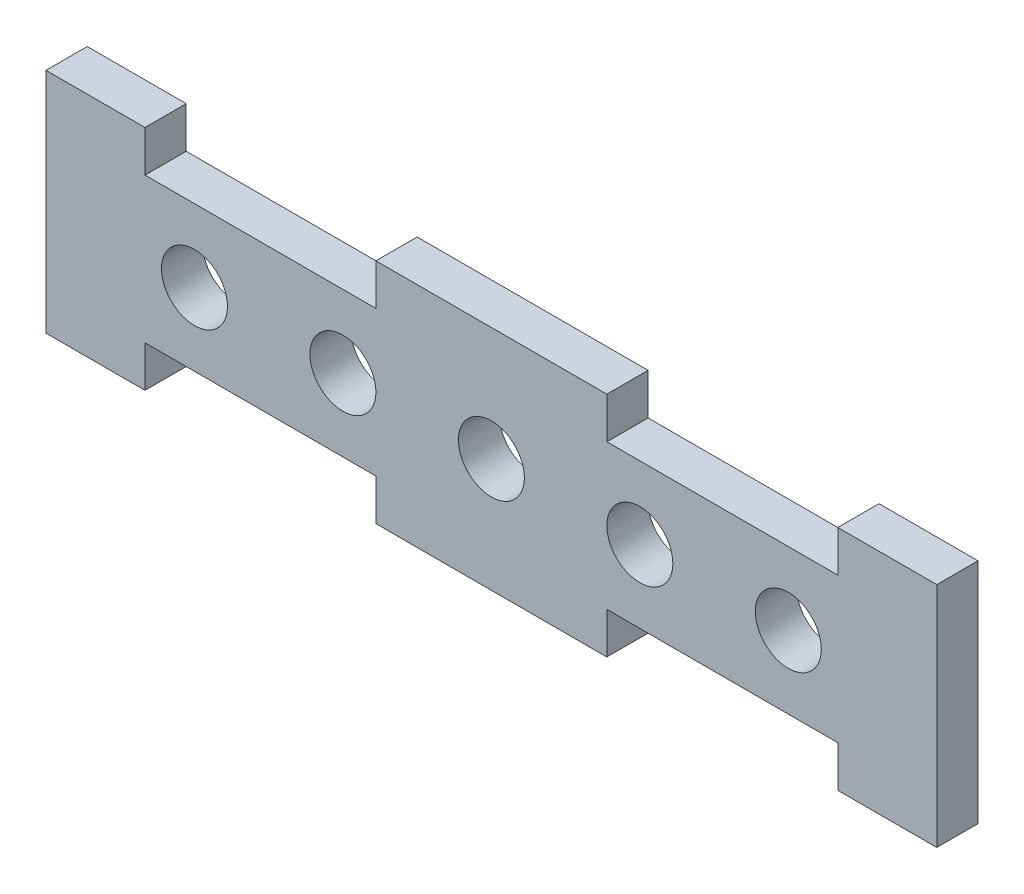
ISO-10303-21;
HEADER;
FILE_DESCRIPTION(('STEP AP214'),'2;1');
FILE_NAME('part.step','',(''),(''),'','','');
FILE_SCHEMA(('AUTOMOTIVE_DESIGN { 1 0 10303 214 1 1 1 1 }'));
ENDSEC;
DATA;
#1=APPLICATION_CONTEXT('core data for automotive mechanical design processes');
#2=APPLICATION_PROTOCOL_DEFINITION('international standard','automotive_design',2000,#1);
#3=PRODUCT_CONTEXT('',#1,'mechanical');
#4=PRODUCT('Part','Part','',(#3));
#5=PRODUCT_RELATED_PRODUCT_CATEGORY('part','',(#4));
#6=PRODUCT_DEFINITION_FORMATION('','',#4);
#7=PRODUCT_DEFINITION_CONTEXT('part definition',#1,'design');
#8=PRODUCT_DEFINITION('design','',#6,#7);
#9=PRODUCT_DEFINITION_SHAPE('','',#8);
#10=(LENGTH_UNIT() NAMED_UNIT(*) SI_UNIT(.MILLI.,.METRE.));
#11=(NAMED_UNIT(*) PLANE_ANGLE_UNIT() SI_UNIT($,.RADIAN.));
#12=(NAMED_UNIT(*) SI_UNIT($,.STERADIAN.) SOLID_ANGLE_UNIT());
#13=UNCERTAINTY_MEASURE_WITH_UNIT(LENGTH_MEASURE(1.E-05),#10,'distance_accuracy_value','');
#14=(GEOMETRIC_REPRESENTATION_CONTEXT(3) GLOBAL_UNCERTAINTY_ASSIGNED_CONTEXT((#13)) GLOBAL_UNIT_ASSIGNED_CONTEXT((#10,
#11,#12)) REPRESENTATION_CONTEXT('',''));
#15=CARTESIAN_POINT('',(0.,0.,0.));
#16=DIRECTION('',(0.,0.,1.));
#17=DIRECTION('',(1.,0.,0.));
#18=AXIS2_PLACEMENT_3D('',#15,#16,#17);
#19=CARTESIAN_POINT('',(0.,0.,3.175));
#20=DIRECTION('',(0.,0.,1.));
#21=DIRECTION('',(1.,0.,0.));
#22=AXIS2_PLACEMENT_3D('',#19,#20,#21);
#23=PLANE('',#22);
#24=DIRECTION('',(0.,-1.,0.));
#25=VECTOR('',#24,1.);
#26=CARTESIAN_POINT('',(72.39,0.,3.175));
#27=LINE('',#26,#25);
#28=CARTESIAN_POINT('',(72.39,0.,3.175));
#29=VERTEX_POINT('',#28);
#30=CARTESIAN_POINT('',(72.39,-17.526,3.175));
#31=VERTEX_POINT('',#30);
#32=EDGE_CURVE('E171',#29,#31,#27,.T.);
#33=ORIENTED_EDGE('',*,*,#32,.F.);
#34=DIRECTION('',(-1.,0.,0.));
#35=VECTOR('',#34,1.);
#36=CARTESIAN_POINT('',(0.,0.,3.175));
#37=LINE('',#36,#35);
#38=CARTESIAN_POINT('',(64.77,0.,3.175));
#39=VERTEX_POINT('',#38);
#40=EDGE_CURVE('E11',#29,#39,#37,.T.);
#41=ORIENTED_EDGE('',*,*,#40,.T.);
#42=DIRECTION('',(0.,-1.,0.));
#43=VECTOR('',#42,1.);
#44=CARTESIAN_POINT('',(64.77,0.,3.175));
#45=LINE('',#44,#43);
#46=CARTESIAN_POINT('',(64.77,-3.175,3.175));
#47=VERTEX_POINT('',#46);
#48=EDGE_CURVE('E336',#39,#47,#45,.T.);
#49=ORIENTED_EDGE('',*,*,#48,.T.);
#50=DIRECTION('',(-1.,0.,0.));
#51=VECTOR('',#50,1.);
#52=CARTESIAN_POINT('',(64.77,-3.175,3.175));
#53=LINE('',#52,#51);
#54=CARTESIAN_POINT('',(46.99,-3.175,3.175));
#55=VERTEX_POINT('',#54);
#56=EDGE_CURVE('E345',#47,#55,#53,.T.);
#57=ORIENTED_EDGE('',*,*,#56,.T.);
#58=DIRECTION('',(0.,1.,0.));
#59=VECTOR('',#58,1.);
#60=CARTESIAN_POINT('',(46.99,0.,3.175));
#61=LINE('',#60,#59);
#62=CARTESIAN_POINT('',(46.99,0.,3.175));
#63=VERTEX_POINT('',#62);
#64=EDGE_CURVE('E348',#55,#63,#61,.T.);
#65=ORIENTED_EDGE('',*,*,#64,.T.);
#66=CARTESIAN_POINT('',(29.21,0.,3.175));
#67=VERTEX_POINT('',#66);
#68=EDGE_CURVE('E41',#63,#67,#37,.T.);
#69=ORIENTED_EDGE('',*,*,#68,.T.);
#70=DIRECTION('',(0.,1.,0.));
#71=VECTOR('',#70,1.);
#72=CARTESIAN_POINT('',(29.21,0.,3.175));
#73=LINE('',#72,#71);
#74=CARTESIAN_POINT('',(29.21,-3.175,3.175));
#75=VERTEX_POINT('',#74);
#76=EDGE_CURVE('E234',#75,#67,#73,.T.);
#77=ORIENTED_EDGE('',*,*,#76,.F.);
#78=DIRECTION('',(1.,0.,0.));
#79=VECTOR('',#78,1.);
#80=CARTESIAN_POINT('',(11.43,-3.175,3.175));
#81=LINE('',#80,#79);
#82=CARTESIAN_POINT('',(11.43,-3.175,3.175));
#83=VERTEX_POINT('',#82);
#84=EDGE_CURVE('E243',#83,#75,#81,.T.);
#85=ORIENTED_EDGE('',*,*,#84,.F.);
#86=DIRECTION('',(0.,-1.,0.));
#87=VECTOR('',#86,1.);
#88=CARTESIAN_POINT('',(11.43,0.,3.175));
#89=LINE('',#88,#87);
#90=CARTESIAN_POINT('',(11.43,0.,3.175));
#91=VERTEX_POINT('',#90);
#92=EDGE_CURVE('E223',#91,#83,#89,.T.);
#93=ORIENTED_EDGE('',*,*,#92,.F.);
#94=CARTESIAN_POINT('',(3.81,0.,3.175));
#95=VERTEX_POINT('',#94);
#96=EDGE_CURVE('E43',#91,#95,#37,.T.);
#97=ORIENTED_EDGE('',*,*,#96,.T.);
#98=DIRECTION('',(0.,1.,0.));
#99=VECTOR('',#98,1.);
#100=CARTESIAN_POINT('',(3.81,0.,3.175));
#101=LINE('',#100,#99);
#102=CARTESIAN_POINT('',(3.81,-17.526,3.175));
#103=VERTEX_POINT('',#102);
#104=EDGE_CURVE('E58',#103,#95,#101,.T.);
#105=ORIENTED_EDGE('',*,*,#104,.F.);
#106=DIRECTION('',(1.,0.,0.));
#107=VECTOR('',#106,1.);
#108=CARTESIAN_POINT('',(0.,-17.526,3.175));
#109=LINE('',#108,#107);
#110=CARTESIAN_POINT('',(11.43,-17.526,3.175));
#111=VERTEX_POINT('',#110);
#112=EDGE_CURVE('E257',#103,#111,#109,.T.);
#113=ORIENTED_EDGE('',*,*,#112,.T.);
#114=DIRECTION('',(0.,1.,0.));
#115=VECTOR('',#114,1.);
#116=CARTESIAN_POINT('',(11.43,-17.526,3.175));
#117=LINE('',#116,#115);
#118=CARTESIAN_POINT('',(11.43,-14.351,3.175));
#119=VERTEX_POINT('',#118);
#120=EDGE_CURVE('E211',#111,#119,#117,.T.);
#121=ORIENTED_EDGE('',*,*,#120,.T.);
#122=DIRECTION('',(1.,0.,0.));
#123=VECTOR('',#122,1.);
#124=CARTESIAN_POINT('',(11.43,-14.351,3.175));
#125=LINE('',#124,#123);
#126=CARTESIAN_POINT('',(29.21,-14.351,3.175));
#127=VERTEX_POINT('',#126);
#128=EDGE_CURVE('E205',#119,#127,#125,.T.);
#129=ORIENTED_EDGE('',*,*,#128,.T.);
#130=DIRECTION('',(0.,-1.,0.));
#131=VECTOR('',#130,1.);
#132=CARTESIAN_POINT('',(29.21,-17.526,3.175));
#133=LINE('',#132,#131);
#134=CARTESIAN_POINT('',(29.21,-17.526,3.175));
#135=VERTEX_POINT('',#134);
#136=EDGE_CURVE('E214',#127,#135,#133,.T.);
#137=ORIENTED_EDGE('',*,*,#136,.T.);
#138=CARTESIAN_POINT('',(46.99,-17.526,3.175));
#139=VERTEX_POINT('',#138);
#140=EDGE_CURVE('E258',#135,#139,#109,.T.);
#141=ORIENTED_EDGE('',*,*,#140,.T.);
#142=DIRECTION('',(0.,-1.,0.));
#143=VECTOR('',#142,1.);
#144=CARTESIAN_POINT('',(46.99,-17.526,3.175));
#145=LINE('',#144,#143);
#146=CARTESIAN_POINT('',(46.99,-14.351,3.175));
#147=VERTEX_POINT('',#146);
#148=EDGE_CURVE('E323',#147,#139,#145,.T.);
#149=ORIENTED_EDGE('',*,*,#148,.F.);
#150=DIRECTION('',(-1.,0.,0.));
#151=VECTOR('',#150,1.);
#152=CARTESIAN_POINT('',(64.77,-14.351,3.175));
#153=LINE('',#152,#151);
#154=CARTESIAN_POINT('',(64.77,-14.351,3.175));
#155=VERTEX_POINT('',#154);
#156=EDGE_CURVE('E331',#155,#147,#153,.T.);
#157=ORIENTED_EDGE('',*,*,#156,.F.);
#158=DIRECTION('',(0.,1.,0.));
#159=VECTOR('',#158,1.);
#160=CARTESIAN_POINT('',(64.77,-17.526,3.175));
#161=LINE('',#160,#159);
#162=CARTESIAN_POINT('',(64.77,-17.526,3.175));
#163=VERTEX_POINT('',#162);
#164=EDGE_CURVE('E320',#163,#155,#161,.T.);
#165=ORIENTED_EDGE('',*,*,#164,.F.);
#166=EDGE_CURVE('E184',#163,#31,#109,.T.);
#167=ORIENTED_EDGE('',*,*,#166,.T.);
#168=EDGE_LOOP('',(#33,#41,#49,#57,#65,#69,#77,#85,#93,#97,#105,#113,#121,#129,#137,#141,#149,
#157,#165,#167));
#169=FACE_BOUND('',#168,.T.);
#170=CARTESIAN_POINT('',(60.96,-8.763,3.175));
#171=DIRECTION('',(0.,0.,1.));
#172=DIRECTION('',(1.,0.,0.));
#173=AXIS2_PLACEMENT_3D('',#170,#171,#172);
#174=CIRCLE('',#173,2.54000000000001);
#175=CARTESIAN_POINT('',(63.5,-8.763,3.175));
#176=VERTEX_POINT('',#175);
#177=EDGE_CURVE('E314',#176,#176,#174,.T.);
#178=ORIENTED_EDGE('',*,*,#177,.F.);
#179=EDGE_LOOP('',(#178));
#180=FACE_BOUND('',#179,.T.);
#181=CARTESIAN_POINT('',(49.53,-8.763,3.175));
#182=DIRECTION('',(0.,0.,1.));
#183=DIRECTION('',(1.,0.,0.));
#184=AXIS2_PLACEMENT_3D('',#181,#182,#183);
#185=CIRCLE('',#184,2.54000000000001);
#186=CARTESIAN_POINT('',(52.07,-8.763,3.175));
#187=VERTEX_POINT('',#186);
#188=EDGE_CURVE('E308',#187,#187,#185,.T.);
#189=ORIENTED_EDGE('',*,*,#188,.F.);
#190=EDGE_LOOP('',(#189));
#191=FACE_BOUND('',#190,.T.);
#192=CARTESIAN_POINT('',(26.67,-8.763,3.175));
#193=DIRECTION('',(0.,0.,1.));
#194=DIRECTION('',(1.,0.,0.));
#195=AXIS2_PLACEMENT_3D('',#192,#193,#194);
#196=CIRCLE('',#195,2.54000000000001);
#197=CARTESIAN_POINT('',(29.21,-8.763,3.175));
#198=VERTEX_POINT('',#197);
#199=EDGE_CURVE('E302',#198,#198,#196,.T.);
#200=ORIENTED_EDGE('',*,*,#199,.F.);
#201=EDGE_LOOP('',(#200));
#202=FACE_BOUND('',#201,.T.);
#203=CARTESIAN_POINT('',(38.1,-8.763,3.175));
#204=DIRECTION('',(0.,0.,1.));
#205=DIRECTION('',(1.,0.,0.));
#206=AXIS2_PLACEMENT_3D('',#203,#204,#205);
#207=CIRCLE('',#206,2.54000000000001);
#208=CARTESIAN_POINT('',(40.64,-8.763,3.175));
#209=VERTEX_POINT('',#208);
#210=EDGE_CURVE('E296',#209,#209,#207,.T.);
#211=ORIENTED_EDGE('',*,*,#210,.F.);
#212=EDGE_LOOP('',(#211));
#213=FACE_BOUND('',#212,.T.);
#214=CARTESIAN_POINT('',(15.24,-8.763,3.175));
#215=DIRECTION('',(0.,0.,1.));
#216=DIRECTION('',(1.,0.,0.));
#217=AXIS2_PLACEMENT_3D('',#214,#215,#216);
#218=CIRCLE('',#217,2.54000000000001);
#219=CARTESIAN_POINT('',(17.78,-8.763,3.175));
#220=VERTEX_POINT('',#219);
#221=EDGE_CURVE('E290',#220,#220,#218,.T.);
#222=ORIENTED_EDGE('',*,*,#221,.F.);
#223=EDGE_LOOP('',(#222));
#224=FACE_BOUND('',#223,.T.);
#225=ADVANCED_FACE('F32',(#169,#180,#191,#202,#213,#224),#23,.T.);
#226=CARTESIAN_POINT('',(0.,0.,0.));
#227=DIRECTION('',(0.,0.,1.));
#228=DIRECTION('',(1.,0.,0.));
#229=AXIS2_PLACEMENT_3D('',#226,#227,#228);
#230=PLANE('',#229);
#231=CARTESIAN_POINT('',(60.96,-8.763,0.));
#232=DIRECTION('',(0.,0.,1.));
#233=DIRECTION('',(1.,0.,0.));
#234=AXIS2_PLACEMENT_3D('',#231,#232,#233);
#235=CIRCLE('',#234,2.54000000000001);
#236=CARTESIAN_POINT('',(63.5,-8.763,0.));
#237=VERTEX_POINT('',#236);
#238=EDGE_CURVE('E317',#237,#237,#235,.T.);
#239=ORIENTED_EDGE('',*,*,#238,.T.);
#240=EDGE_LOOP('',(#239));
#241=FACE_BOUND('',#240,.T.);
#242=CARTESIAN_POINT('',(49.53,-8.763,0.));
#243=DIRECTION('',(0.,0.,1.));
#244=DIRECTION('',(1.,0.,0.));
#245=AXIS2_PLACEMENT_3D('',#242,#243,#244);
#246=CIRCLE('',#245,2.54000000000001);
#247=CARTESIAN_POINT('',(52.07,-8.763,0.));
#248=VERTEX_POINT('',#247);
#249=EDGE_CURVE('E311',#248,#248,#246,.T.);
#250=ORIENTED_EDGE('',*,*,#249,.T.);
#251=EDGE_LOOP('',(#250));
#252=FACE_BOUND('',#251,.T.);
#253=CARTESIAN_POINT('',(26.67,-8.763,0.));
#254=DIRECTION('',(0.,0.,1.));
#255=DIRECTION('',(1.,0.,0.));
#256=AXIS2_PLACEMENT_3D('',#253,#254,#255);
#257=CIRCLE('',#256,2.54000000000001);
#258=CARTESIAN_POINT('',(29.21,-8.763,0.));
#259=VERTEX_POINT('',#258);
#260=EDGE_CURVE('E305',#259,#259,#257,.T.);
#261=ORIENTED_EDGE('',*,*,#260,.T.);
#262=EDGE_LOOP('',(#261));
#263=FACE_BOUND('',#262,.T.);
#264=CARTESIAN_POINT('',(38.1,-8.763,0.));
#265=DIRECTION('',(0.,0.,1.));
#266=DIRECTION('',(1.,0.,0.));
#267=AXIS2_PLACEMENT_3D('',#264,#265,#266);
#268=CIRCLE('',#267,2.54000000000001);
#269=CARTESIAN_POINT('',(40.64,-8.763,0.));
#270=VERTEX_POINT('',#269);
#271=EDGE_CURVE('E299',#270,#270,#268,.T.);
#272=ORIENTED_EDGE('',*,*,#271,.T.);
#273=EDGE_LOOP('',(#272));
#274=FACE_BOUND('',#273,.T.);
#275=CARTESIAN_POINT('',(15.24,-8.763,0.));
#276=DIRECTION('',(0.,0.,1.));
#277=DIRECTION('',(1.,0.,0.));
#278=AXIS2_PLACEMENT_3D('',#275,#276,#277);
#279=CIRCLE('',#278,2.54000000000001);
#280=CARTESIAN_POINT('',(17.78,-8.763,0.));
#281=VERTEX_POINT('',#280);
#282=EDGE_CURVE('E293',#281,#281,#279,.T.);
#283=ORIENTED_EDGE('',*,*,#282,.T.);
#284=EDGE_LOOP('',(#283));
#285=FACE_BOUND('',#284,.T.);
#286=DIRECTION('',(-1.,0.,0.));
#287=VECTOR('',#286,1.);
#288=CARTESIAN_POINT('',(0.,0.,0.));
#289=LINE('',#288,#287);
#290=CARTESIAN_POINT('',(72.39,0.,0.));
#291=VERTEX_POINT('',#290);
#292=CARTESIAN_POINT('',(64.77,0.,0.));
#293=VERTEX_POINT('',#292);
#294=EDGE_CURVE('E36',#291,#293,#289,.T.);
#295=ORIENTED_EDGE('',*,*,#294,.F.);
#296=DIRECTION('',(0.,1.,0.));
#297=VECTOR('',#296,1.);
#298=CARTESIAN_POINT('',(72.39,0.,0.));
#299=LINE('',#298,#297);
#300=CARTESIAN_POINT('',(72.39,-17.526,0.));
#301=VERTEX_POINT('',#300);
#302=EDGE_CURVE('E50',#301,#291,#299,.T.);
#303=ORIENTED_EDGE('',*,*,#302,.F.);
#304=DIRECTION('',(1.,0.,0.));
#305=VECTOR('',#304,1.);
#306=CARTESIAN_POINT('',(0.,-17.526,0.));
#307=LINE('',#306,#305);
#308=CARTESIAN_POINT('',(64.77,-17.526,0.));
#309=VERTEX_POINT('',#308);
#310=EDGE_CURVE('E250',#309,#301,#307,.T.);
#311=ORIENTED_EDGE('',*,*,#310,.F.);
#312=DIRECTION('',(0.,1.,0.));
#313=VECTOR('',#312,1.);
#314=CARTESIAN_POINT('',(64.77,-17.526,0.));
#315=LINE('',#314,#313);
#316=CARTESIAN_POINT('',(64.77,-14.351,0.));
#317=VERTEX_POINT('',#316);
#318=EDGE_CURVE('E279',#309,#317,#315,.T.);
#319=ORIENTED_EDGE('',*,*,#318,.T.);
#320=DIRECTION('',(-1.,0.,0.));
#321=VECTOR('',#320,1.);
#322=CARTESIAN_POINT('',(64.77,-14.351,0.));
#323=LINE('',#322,#321);
#324=CARTESIAN_POINT('',(46.99,-14.351,0.));
#325=VERTEX_POINT('',#324);
#326=EDGE_CURVE('E322',#317,#325,#323,.T.);
#327=ORIENTED_EDGE('',*,*,#326,.T.);
#328=DIRECTION('',(0.,-1.,0.));
#329=VECTOR('',#328,1.);
#330=CARTESIAN_POINT('',(46.99,-17.526,0.));
#331=LINE('',#330,#329);
#332=CARTESIAN_POINT('',(46.99,-17.526,0.));
#333=VERTEX_POINT('',#332);
#334=EDGE_CURVE('E325',#325,#333,#331,.T.);
#335=ORIENTED_EDGE('',*,*,#334,.T.);
#336=CARTESIAN_POINT('',(29.21,-17.526,0.));
#337=VERTEX_POINT('',#336);
#338=EDGE_CURVE('E261',#337,#333,#307,.T.);
#339=ORIENTED_EDGE('',*,*,#338,.F.);
#340=DIRECTION('',(0.,-1.,0.));
#341=VECTOR('',#340,1.);
#342=CARTESIAN_POINT('',(29.21,-17.526,0.));
#343=LINE('',#342,#341);
#344=CARTESIAN_POINT('',(29.21,-14.351,0.));
#345=VERTEX_POINT('',#344);
#346=EDGE_CURVE('E204',#345,#337,#343,.T.);
#347=ORIENTED_EDGE('',*,*,#346,.F.);
#348=DIRECTION('',(1.,0.,0.));
#349=VECTOR('',#348,1.);
#350=CARTESIAN_POINT('',(11.43,-14.351,0.));
#351=LINE('',#350,#349);
#352=CARTESIAN_POINT('',(11.43,-14.351,0.));
#353=VERTEX_POINT('',#352);
#354=EDGE_CURVE('E207',#353,#345,#351,.T.);
#355=ORIENTED_EDGE('',*,*,#354,.F.);
#356=DIRECTION('',(0.,1.,0.));
#357=VECTOR('',#356,1.);
#358=CARTESIAN_POINT('',(11.43,-17.526,0.));
#359=LINE('',#358,#357);
#360=CARTESIAN_POINT('',(11.43,-17.526,0.));
#361=VERTEX_POINT('',#360);
#362=EDGE_CURVE('E202',#361,#353,#359,.T.);
#363=ORIENTED_EDGE('',*,*,#362,.F.);
#364=CARTESIAN_POINT('',(3.81,-17.526,0.));
#365=VERTEX_POINT('',#364);
#366=EDGE_CURVE('E259',#365,#361,#307,.T.);
#367=ORIENTED_EDGE('',*,*,#366,.F.);
#368=DIRECTION('',(0.,-1.,0.));
#369=VECTOR('',#368,1.);
#370=CARTESIAN_POINT('',(3.81,0.,0.));
#371=LINE('',#370,#369);
#372=CARTESIAN_POINT('',(3.81,0.,0.));
#373=VERTEX_POINT('',#372);
#374=EDGE_CURVE('E283',#373,#365,#371,.T.);
#375=ORIENTED_EDGE('',*,*,#374,.F.);
#376=CARTESIAN_POINT('',(11.43,0.,0.));
#377=VERTEX_POINT('',#376);
#378=EDGE_CURVE('E260',#377,#373,#289,.T.);
#379=ORIENTED_EDGE('',*,*,#378,.F.);
#380=DIRECTION('',(0.,-1.,0.));
#381=VECTOR('',#380,1.);
#382=CARTESIAN_POINT('',(11.43,0.,0.));
#383=LINE('',#382,#381);
#384=CARTESIAN_POINT('',(11.43,-3.175,0.));
#385=VERTEX_POINT('',#384);
#386=EDGE_CURVE('E230',#377,#385,#383,.T.);
#387=ORIENTED_EDGE('',*,*,#386,.T.);
#388=DIRECTION('',(1.,0.,0.));
#389=VECTOR('',#388,1.);
#390=CARTESIAN_POINT('',(11.43,-3.175,0.));
#391=LINE('',#390,#389);
#392=CARTESIAN_POINT('',(29.21,-3.175,0.));
#393=VERTEX_POINT('',#392);
#394=EDGE_CURVE('E233',#385,#393,#391,.T.);
#395=ORIENTED_EDGE('',*,*,#394,.T.);
#396=DIRECTION('',(0.,1.,0.));
#397=VECTOR('',#396,1.);
#398=CARTESIAN_POINT('',(29.21,0.,0.));
#399=LINE('',#398,#397);
#400=CARTESIAN_POINT('',(29.21,0.,0.));
#401=VERTEX_POINT('',#400);
#402=EDGE_CURVE('E237',#393,#401,#399,.T.);
#403=ORIENTED_EDGE('',*,*,#402,.T.);
#404=CARTESIAN_POINT('',(46.99,0.,0.));
#405=VERTEX_POINT('',#404);
#406=EDGE_CURVE('E267',#405,#401,#289,.T.);
#407=ORIENTED_EDGE('',*,*,#406,.F.);
#408=DIRECTION('',(0.,1.,0.));
#409=VECTOR('',#408,1.);
#410=CARTESIAN_POINT('',(46.99,0.,0.));
#411=LINE('',#410,#409);
#412=CARTESIAN_POINT('',(46.99,-3.175,0.));
#413=VERTEX_POINT('',#412);
#414=EDGE_CURVE('E198',#413,#405,#411,.T.);
#415=ORIENTED_EDGE('',*,*,#414,.F.);
#416=DIRECTION('',(-1.,0.,0.));
#417=VECTOR('',#416,1.);
#418=CARTESIAN_POINT('',(64.77,-3.175,0.));
#419=LINE('',#418,#417);
#420=CARTESIAN_POINT('',(64.77,-3.175,0.));
#421=VERTEX_POINT('',#420);
#422=EDGE_CURVE('E194',#421,#413,#419,.T.);
#423=ORIENTED_EDGE('',*,*,#422,.F.);
#424=DIRECTION('',(0.,-1.,0.));
#425=VECTOR('',#424,1.);
#426=CARTESIAN_POINT('',(64.77,0.,0.));
#427=LINE('',#426,#425);
#428=EDGE_CURVE('E343',#293,#421,#427,.T.);
#429=ORIENTED_EDGE('',*,*,#428,.F.);
#430=EDGE_LOOP('',(#295,#303,#311,#319,#327,#335,#339,#347,#355,#363,#367,#375,#379,#387,#395,
#403,#407,#415,#423,#429));
#431=FACE_BOUND('',#430,.T.);
#432=ADVANCED_FACE('F277',(#241,#252,#263,#274,#285,#431),#230,.F.);
#433=CARTESIAN_POINT('',(0.,-17.526,3.175));
#434=DIRECTION('',(0.,1.,0.));
#435=DIRECTION('',(0.,0.,1.));
#436=AXIS2_PLACEMENT_3D('',#433,#434,#435);
#437=PLANE('',#436);
#438=DIRECTION('',(0.,0.,1.));
#439=VECTOR('',#438,1.);
#440=CARTESIAN_POINT('',(3.81,-17.526,0.));
#441=LINE('',#440,#439);
#442=EDGE_CURVE('E285',#365,#103,#441,.T.);
#443=ORIENTED_EDGE('',*,*,#442,.F.);
#444=ORIENTED_EDGE('',*,*,#366,.T.);
#445=DIRECTION('',(0.,0.,1.));
#446=VECTOR('',#445,1.);
#447=CARTESIAN_POINT('',(11.43,-17.526,0.));
#448=LINE('',#447,#446);
#449=EDGE_CURVE('E210',#361,#111,#448,.T.);
#450=ORIENTED_EDGE('',*,*,#449,.T.);
#451=ORIENTED_EDGE('',*,*,#112,.F.);
#452=EDGE_LOOP('',(#443,#444,#450,#451));
#453=FACE_BOUND('',#452,.T.);
#454=ADVANCED_FACE('F34',(#453),#437,.F.);
#455=CARTESIAN_POINT('',(0.,0.,3.175));
#456=DIRECTION('',(0.,-1.,0.));
#457=DIRECTION('',(0.,0.,-1.));
#458=AXIS2_PLACEMENT_3D('',#455,#456,#457);
#459=PLANE('',#458);
#460=DIRECTION('',(0.,0.,-1.));
#461=VECTOR('',#460,1.);
#462=CARTESIAN_POINT('',(3.81,0.,0.));
#463=LINE('',#462,#461);
#464=EDGE_CURVE('E288',#95,#373,#463,.T.);
#465=ORIENTED_EDGE('',*,*,#464,.F.);
#466=ORIENTED_EDGE('',*,*,#96,.F.);
#467=DIRECTION('',(0.,0.,1.));
#468=VECTOR('',#467,1.);
#469=CARTESIAN_POINT('',(11.43,0.,0.));
#470=LINE('',#469,#468);
#471=EDGE_CURVE('E248',#377,#91,#470,.T.);
#472=ORIENTED_EDGE('',*,*,#471,.F.);
#473=ORIENTED_EDGE('',*,*,#378,.T.);
#474=EDGE_LOOP('',(#465,#466,#472,#473));
#475=FACE_BOUND('',#474,.T.);
#476=ADVANCED_FACE('F378',(#475),#459,.F.);
#477=ORIENTED_EDGE('',*,*,#310,.T.);
#478=DIRECTION('',(0.,0.,-1.));
#479=VECTOR('',#478,1.);
#480=CARTESIAN_POINT('',(72.39,-17.526,0.));
#481=LINE('',#480,#479);
#482=EDGE_CURVE('E185',#31,#301,#481,.T.);
#483=ORIENTED_EDGE('',*,*,#482,.F.);
#484=ORIENTED_EDGE('',*,*,#166,.F.);
#485=DIRECTION('',(0.,0.,1.));
#486=VECTOR('',#485,1.);
#487=CARTESIAN_POINT('',(64.77,-17.526,0.));
#488=LINE('',#487,#486);
#489=EDGE_CURVE('E274',#309,#163,#488,.T.);
#490=ORIENTED_EDGE('',*,*,#489,.F.);
#491=EDGE_LOOP('',(#477,#483,#484,#490));
#492=FACE_BOUND('',#491,.T.);
#493=ADVANCED_FACE('F273',(#492),#437,.F.);
#494=ORIENTED_EDGE('',*,*,#40,.F.);
#495=DIRECTION('',(0.,0.,1.));
#496=VECTOR('',#495,1.);
#497=CARTESIAN_POINT('',(72.39,0.,0.));
#498=LINE('',#497,#496);
#499=EDGE_CURVE('E168',#291,#29,#498,.T.);
#500=ORIENTED_EDGE('',*,*,#499,.F.);
#501=ORIENTED_EDGE('',*,*,#294,.T.);
#502=DIRECTION('',(0.,0.,1.));
#503=VECTOR('',#502,1.);
#504=CARTESIAN_POINT('',(64.77,0.,0.));
#505=LINE('',#504,#503);
#506=EDGE_CURVE('E190',#293,#39,#505,.T.);
#507=ORIENTED_EDGE('',*,*,#506,.T.);
#508=EDGE_LOOP('',(#494,#500,#501,#507));
#509=FACE_BOUND('',#508,.T.);
#510=ADVANCED_FACE('F188',(#509),#459,.F.);
#511=DIRECTION('',(0.,0.,1.));
#512=VECTOR('',#511,1.);
#513=CARTESIAN_POINT('',(46.99,0.,0.));
#514=LINE('',#513,#512);
#515=EDGE_CURVE('E193',#405,#63,#514,.T.);
#516=ORIENTED_EDGE('',*,*,#515,.F.);
#517=ORIENTED_EDGE('',*,*,#406,.T.);
#518=DIRECTION('',(0.,0.,1.));
#519=VECTOR('',#518,1.);
#520=CARTESIAN_POINT('',(29.21,0.,0.));
#521=LINE('',#520,#519);
#522=EDGE_CURVE('E251',#401,#67,#521,.T.);
#523=ORIENTED_EDGE('',*,*,#522,.T.);
#524=ORIENTED_EDGE('',*,*,#68,.F.);
#525=EDGE_LOOP('',(#516,#517,#523,#524));
#526=FACE_BOUND('',#525,.T.);
#527=ADVANCED_FACE('F368',(#526),#459,.F.);
#528=ORIENTED_EDGE('',*,*,#338,.T.);
#529=DIRECTION('',(0.,0.,1.));
#530=VECTOR('',#529,1.);
#531=CARTESIAN_POINT('',(46.99,-17.526,0.));
#532=LINE('',#531,#530);
#533=EDGE_CURVE('E337',#333,#139,#532,.T.);
#534=ORIENTED_EDGE('',*,*,#533,.T.);
#535=ORIENTED_EDGE('',*,*,#140,.F.);
#536=DIRECTION('',(0.,0.,1.));
#537=VECTOR('',#536,1.);
#538=CARTESIAN_POINT('',(29.21,-17.526,0.));
#539=LINE('',#538,#537);
#540=EDGE_CURVE('E226',#337,#135,#539,.T.);
#541=ORIENTED_EDGE('',*,*,#540,.F.);
#542=EDGE_LOOP('',(#528,#534,#535,#541));
#543=FACE_BOUND('',#542,.T.);
#544=ADVANCED_FACE('F395',(#543),#437,.F.);
#545=CARTESIAN_POINT('',(11.43,0.,0.));
#546=DIRECTION('',(-1.,0.,0.));
#547=DIRECTION('',(0.,0.,1.));
#548=AXIS2_PLACEMENT_3D('',#545,#546,#547);
#549=PLANE('',#548);
#550=ORIENTED_EDGE('',*,*,#92,.T.);
#551=DIRECTION('',(0.,0.,1.));
#552=VECTOR('',#551,1.);
#553=CARTESIAN_POINT('',(11.43,-3.175,0.));
#554=LINE('',#553,#552);
#555=EDGE_CURVE('E240',#385,#83,#554,.T.);
#556=ORIENTED_EDGE('',*,*,#555,.F.);
#557=ORIENTED_EDGE('',*,*,#386,.F.);
#558=ORIENTED_EDGE('',*,*,#471,.T.);
#559=EDGE_LOOP('',(#550,#556,#557,#558));
#560=FACE_BOUND('',#559,.T.);
#561=ADVANCED_FACE('F404',(#560),#549,.F.);
#562=CARTESIAN_POINT('',(29.21,0.,0.));
#563=DIRECTION('',(1.,0.,0.));
#564=DIRECTION('',(0.,0.,-1.));
#565=AXIS2_PLACEMENT_3D('',#562,#563,#564);
#566=PLANE('',#565);
#567=ORIENTED_EDGE('',*,*,#76,.T.);
#568=ORIENTED_EDGE('',*,*,#522,.F.);
#569=ORIENTED_EDGE('',*,*,#402,.F.);
#570=DIRECTION('',(0.,0.,1.));
#571=VECTOR('',#570,1.);
#572=CARTESIAN_POINT('',(29.21,-3.175,0.));
#573=LINE('',#572,#571);
#574=EDGE_CURVE('E254',#393,#75,#573,.T.);
#575=ORIENTED_EDGE('',*,*,#574,.T.);
#576=EDGE_LOOP('',(#567,#568,#569,#575));
#577=FACE_BOUND('',#576,.T.);
#578=ADVANCED_FACE('F430',(#577),#566,.F.);
#579=CARTESIAN_POINT('',(11.43,-3.175,0.));
#580=DIRECTION('',(0.,-1.,0.));
#581=DIRECTION('',(0.,0.,-1.));
#582=AXIS2_PLACEMENT_3D('',#579,#580,#581);
#583=PLANE('',#582);
#584=ORIENTED_EDGE('',*,*,#84,.T.);
#585=ORIENTED_EDGE('',*,*,#574,.F.);
#586=ORIENTED_EDGE('',*,*,#394,.F.);
#587=ORIENTED_EDGE('',*,*,#555,.T.);
#588=EDGE_LOOP('',(#584,#585,#586,#587));
#589=FACE_BOUND('',#588,.T.);
#590=ADVANCED_FACE('F437',(#589),#583,.F.);
#591=CARTESIAN_POINT('',(11.43,-17.526,0.));
#592=DIRECTION('',(1.,0.,0.));
#593=DIRECTION('',(0.,0.,-1.));
#594=AXIS2_PLACEMENT_3D('',#591,#592,#593);
#595=PLANE('',#594);
#596=ORIENTED_EDGE('',*,*,#120,.F.);
#597=ORIENTED_EDGE('',*,*,#449,.F.);
#598=ORIENTED_EDGE('',*,*,#362,.T.);
#599=DIRECTION('',(0.,0.,1.));
#600=VECTOR('',#599,1.);
#601=CARTESIAN_POINT('',(11.43,-14.351,0.));
#602=LINE('',#601,#600);
#603=EDGE_CURVE('E220',#353,#119,#602,.T.);
#604=ORIENTED_EDGE('',*,*,#603,.T.);
#605=EDGE_LOOP('',(#596,#597,#598,#604));
#606=FACE_BOUND('',#605,.T.);
#607=ADVANCED_FACE('F388',(#606),#595,.T.);
#608=CARTESIAN_POINT('',(11.43,-14.351,0.));
#609=DIRECTION('',(0.,-1.,0.));
#610=DIRECTION('',(0.,0.,-1.));
#611=AXIS2_PLACEMENT_3D('',#608,#609,#610);
#612=PLANE('',#611);
#613=ORIENTED_EDGE('',*,*,#128,.F.);
#614=ORIENTED_EDGE('',*,*,#603,.F.);
#615=ORIENTED_EDGE('',*,*,#354,.T.);
#616=DIRECTION('',(0.,0.,1.));
#617=VECTOR('',#616,1.);
#618=CARTESIAN_POINT('',(29.21,-14.351,0.));
#619=LINE('',#618,#617);
#620=EDGE_CURVE('E224',#345,#127,#619,.T.);
#621=ORIENTED_EDGE('',*,*,#620,.T.);
#622=EDGE_LOOP('',(#613,#614,#615,#621));
#623=FACE_BOUND('',#622,.T.);
#624=ADVANCED_FACE('F390',(#623),#612,.T.);
#625=CARTESIAN_POINT('',(29.21,-17.526,0.));
#626=DIRECTION('',(-1.,0.,0.));
#627=DIRECTION('',(0.,0.,1.));
#628=AXIS2_PLACEMENT_3D('',#625,#626,#627);
#629=PLANE('',#628);
#630=ORIENTED_EDGE('',*,*,#136,.F.);
#631=ORIENTED_EDGE('',*,*,#620,.F.);
#632=ORIENTED_EDGE('',*,*,#346,.T.);
#633=ORIENTED_EDGE('',*,*,#540,.T.);
#634=EDGE_LOOP('',(#630,#631,#632,#633));
#635=FACE_BOUND('',#634,.T.);
#636=ADVANCED_FACE('F457',(#635),#629,.T.);
#637=CARTESIAN_POINT('',(64.77,0.,0.));
#638=DIRECTION('',(-1.,0.,0.));
#639=DIRECTION('',(0.,0.,1.));
#640=AXIS2_PLACEMENT_3D('',#637,#638,#639);
#641=PLANE('',#640);
#642=ORIENTED_EDGE('',*,*,#48,.F.);
#643=ORIENTED_EDGE('',*,*,#506,.F.);
#644=ORIENTED_EDGE('',*,*,#428,.T.);
#645=DIRECTION('',(0.,0.,1.));
#646=VECTOR('',#645,1.);
#647=CARTESIAN_POINT('',(64.77,-3.175,0.));
#648=LINE('',#647,#646);
#649=EDGE_CURVE('E215',#421,#47,#648,.T.);
#650=ORIENTED_EDGE('',*,*,#649,.T.);
#651=EDGE_LOOP('',(#642,#643,#644,#650));
#652=FACE_BOUND('',#651,.T.);
#653=ADVANCED_FACE('F365',(#652),#641,.T.);
#654=CARTESIAN_POINT('',(64.77,-3.175,0.));
#655=DIRECTION('',(0.,1.,0.));
#656=DIRECTION('',(0.,0.,1.));
#657=AXIS2_PLACEMENT_3D('',#654,#655,#656);
#658=PLANE('',#657);
#659=ORIENTED_EDGE('',*,*,#56,.F.);
#660=ORIENTED_EDGE('',*,*,#649,.F.);
#661=ORIENTED_EDGE('',*,*,#422,.T.);
#662=DIRECTION('',(0.,0.,1.));
#663=VECTOR('',#662,1.);
#664=CARTESIAN_POINT('',(46.99,-3.175,0.));
#665=LINE('',#664,#663);
#666=EDGE_CURVE('E196',#413,#55,#665,.T.);
#667=ORIENTED_EDGE('',*,*,#666,.T.);
#668=EDGE_LOOP('',(#659,#660,#661,#667));
#669=FACE_BOUND('',#668,.T.);
#670=ADVANCED_FACE('F357',(#669),#658,.T.);
#671=CARTESIAN_POINT('',(46.99,0.,0.));
#672=DIRECTION('',(1.,0.,0.));
#673=DIRECTION('',(0.,0.,-1.));
#674=AXIS2_PLACEMENT_3D('',#671,#672,#673);
#675=PLANE('',#674);
#676=ORIENTED_EDGE('',*,*,#64,.F.);
#677=ORIENTED_EDGE('',*,*,#666,.F.);
#678=ORIENTED_EDGE('',*,*,#414,.T.);
#679=ORIENTED_EDGE('',*,*,#515,.T.);
#680=EDGE_LOOP('',(#676,#677,#678,#679));
#681=FACE_BOUND('',#680,.T.);
#682=ADVANCED_FACE('F362',(#681),#675,.T.);
#683=CARTESIAN_POINT('',(64.77,-17.526,0.));
#684=DIRECTION('',(1.,0.,0.));
#685=DIRECTION('',(0.,0.,-1.));
#686=AXIS2_PLACEMENT_3D('',#683,#684,#685);
#687=PLANE('',#686);
#688=ORIENTED_EDGE('',*,*,#164,.T.);
#689=DIRECTION('',(0.,0.,1.));
#690=VECTOR('',#689,1.);
#691=CARTESIAN_POINT('',(64.77,-14.351,0.));
#692=LINE('',#691,#690);
#693=EDGE_CURVE('E328',#317,#155,#692,.T.);
#694=ORIENTED_EDGE('',*,*,#693,.F.);
#695=ORIENTED_EDGE('',*,*,#318,.F.);
#696=ORIENTED_EDGE('',*,*,#489,.T.);
#697=EDGE_LOOP('',(#688,#694,#695,#696));
#698=FACE_BOUND('',#697,.T.);
#699=ADVANCED_FACE('F481',(#698),#687,.F.);
#700=CARTESIAN_POINT('',(46.99,-17.526,0.));
#701=DIRECTION('',(-1.,0.,0.));
#702=DIRECTION('',(0.,0.,1.));
#703=AXIS2_PLACEMENT_3D('',#700,#701,#702);
#704=PLANE('',#703);
#705=ORIENTED_EDGE('',*,*,#148,.T.);
#706=ORIENTED_EDGE('',*,*,#533,.F.);
#707=ORIENTED_EDGE('',*,*,#334,.F.);
#708=DIRECTION('',(0.,0.,1.));
#709=VECTOR('',#708,1.);
#710=CARTESIAN_POINT('',(46.99,-14.351,0.));
#711=LINE('',#710,#709);
#712=EDGE_CURVE('E340',#325,#147,#711,.T.);
#713=ORIENTED_EDGE('',*,*,#712,.T.);
#714=EDGE_LOOP('',(#705,#706,#707,#713));
#715=FACE_BOUND('',#714,.T.);
#716=ADVANCED_FACE('F488',(#715),#704,.F.);
#717=CARTESIAN_POINT('',(64.77,-14.351,0.));
#718=DIRECTION('',(0.,1.,0.));
#719=DIRECTION('',(0.,0.,1.));
#720=AXIS2_PLACEMENT_3D('',#717,#718,#719);
#721=PLANE('',#720);
#722=ORIENTED_EDGE('',*,*,#156,.T.);
#723=ORIENTED_EDGE('',*,*,#712,.F.);
#724=ORIENTED_EDGE('',*,*,#326,.F.);
#725=ORIENTED_EDGE('',*,*,#693,.T.);
#726=EDGE_LOOP('',(#722,#723,#724,#725));
#727=FACE_BOUND('',#726,.T.);
#728=ADVANCED_FACE('F496',(#727),#721,.F.);
#729=CARTESIAN_POINT('',(60.96,-8.763,3.175));
#730=DIRECTION('',(0.,0.,1.));
#731=DIRECTION('',(1.,0.,0.));
#732=AXIS2_PLACEMENT_3D('',#729,#730,#731);
#733=CYLINDRICAL_SURFACE('',#732,2.54000000000001);
#734=ORIENTED_EDGE('',*,*,#238,.F.);
#735=EDGE_LOOP('',(#734));
#736=FACE_BOUND('',#735,.T.);
#737=ORIENTED_EDGE('',*,*,#177,.T.);
#738=EDGE_LOOP('',(#737));
#739=FACE_BOUND('',#738,.T.);
#740=ADVANCED_FACE('F504',(#736,#739),#733,.F.);
#741=CARTESIAN_POINT('',(49.53,-8.763,3.175));
#742=DIRECTION('',(0.,0.,1.));
#743=DIRECTION('',(1.,0.,0.));
#744=AXIS2_PLACEMENT_3D('',#741,#742,#743);
#745=CYLINDRICAL_SURFACE('',#744,2.54000000000001);
#746=ORIENTED_EDGE('',*,*,#249,.F.);
#747=EDGE_LOOP('',(#746));
#748=FACE_BOUND('',#747,.T.);
#749=ORIENTED_EDGE('',*,*,#188,.T.);
#750=EDGE_LOOP('',(#749));
#751=FACE_BOUND('',#750,.T.);
#752=ADVANCED_FACE('F512',(#748,#751),#745,.F.);
#753=CARTESIAN_POINT('',(26.67,-8.763,3.175));
#754=DIRECTION('',(0.,0.,1.));
#755=DIRECTION('',(1.,0.,0.));
#756=AXIS2_PLACEMENT_3D('',#753,#754,#755);
#757=CYLINDRICAL_SURFACE('',#756,2.54000000000001);
#758=ORIENTED_EDGE('',*,*,#260,.F.);
#759=EDGE_LOOP('',(#758));
#760=FACE_BOUND('',#759,.T.);
#761=ORIENTED_EDGE('',*,*,#199,.T.);
#762=EDGE_LOOP('',(#761));
#763=FACE_BOUND('',#762,.T.);
#764=ADVANCED_FACE('F520',(#760,#763),#757,.F.);
#765=CARTESIAN_POINT('',(38.1,-8.763,3.175));
#766=DIRECTION('',(0.,0.,1.));
#767=DIRECTION('',(1.,0.,0.));
#768=AXIS2_PLACEMENT_3D('',#765,#766,#767);
#769=CYLINDRICAL_SURFACE('',#768,2.54000000000001);
#770=ORIENTED_EDGE('',*,*,#271,.F.);
#771=EDGE_LOOP('',(#770));
#772=FACE_BOUND('',#771,.T.);
#773=ORIENTED_EDGE('',*,*,#210,.T.);
#774=EDGE_LOOP('',(#773));
#775=FACE_BOUND('',#774,.T.);
#776=ADVANCED_FACE('F528',(#772,#775),#769,.F.);
#777=CARTESIAN_POINT('',(15.24,-8.763,3.175));
#778=DIRECTION('',(0.,0.,1.));
#779=DIRECTION('',(1.,0.,0.));
#780=AXIS2_PLACEMENT_3D('',#777,#778,#779);
#781=CYLINDRICAL_SURFACE('',#780,2.54000000000001);
#782=ORIENTED_EDGE('',*,*,#282,.F.);
#783=EDGE_LOOP('',(#782));
#784=FACE_BOUND('',#783,.T.);
#785=ORIENTED_EDGE('',*,*,#221,.T.);
#786=EDGE_LOOP('',(#785));
#787=FACE_BOUND('',#786,.T.);
#788=ADVANCED_FACE('F536',(#784,#787),#781,.F.);
#789=CARTESIAN_POINT('',(3.81,0.,0.));
#790=DIRECTION('',(-1.,0.,0.));
#791=DIRECTION('',(0.,-1.,0.));
#792=AXIS2_PLACEMENT_3D('',#789,#790,#791);
#793=PLANE('',#792);
#794=ORIENTED_EDGE('',*,*,#374,.T.);
#795=ORIENTED_EDGE('',*,*,#442,.T.);
#796=ORIENTED_EDGE('',*,*,#104,.T.);
#797=ORIENTED_EDGE('',*,*,#464,.T.);
#798=EDGE_LOOP('',(#794,#795,#796,#797));
#799=FACE_BOUND('',#798,.T.);
#800=ADVANCED_FACE('F381',(#799),#793,.T.);
#801=CARTESIAN_POINT('',(72.39,0.,0.));
#802=DIRECTION('',(-1.,0.,0.));
#803=DIRECTION('',(0.,0.,1.));
#804=AXIS2_PLACEMENT_3D('',#801,#802,#803);
#805=PLANE('',#804);
#806=ORIENTED_EDGE('',*,*,#302,.T.);
#807=ORIENTED_EDGE('',*,*,#499,.T.);
#808=ORIENTED_EDGE('',*,*,#32,.T.);
#809=ORIENTED_EDGE('',*,*,#482,.T.);
#810=EDGE_LOOP('',(#806,#807,#808,#809));
#811=FACE_BOUND('',#810,.T.);
#812=ADVANCED_FACE('F170',(#811),#805,.F.);
#813=CLOSED_SHELL('',(#225,#432,#454,#476,#493,#510,#527,#544,#561,#578,#590,#607,#624,#636,
#653,#670,#682,#699,#716,#728,#740,#752,#764,#776,#788,#800,#812));
#814=MANIFOLD_SOLID_BREP('B2',#813);
#815=ADVANCED_BREP_SHAPE_REPRESENTATION('',(#18,#814),#14);
#816=SHAPE_DEFINITION_REPRESENTATION(#9,#815);
ENDSEC;
END-ISO-10303-21;
